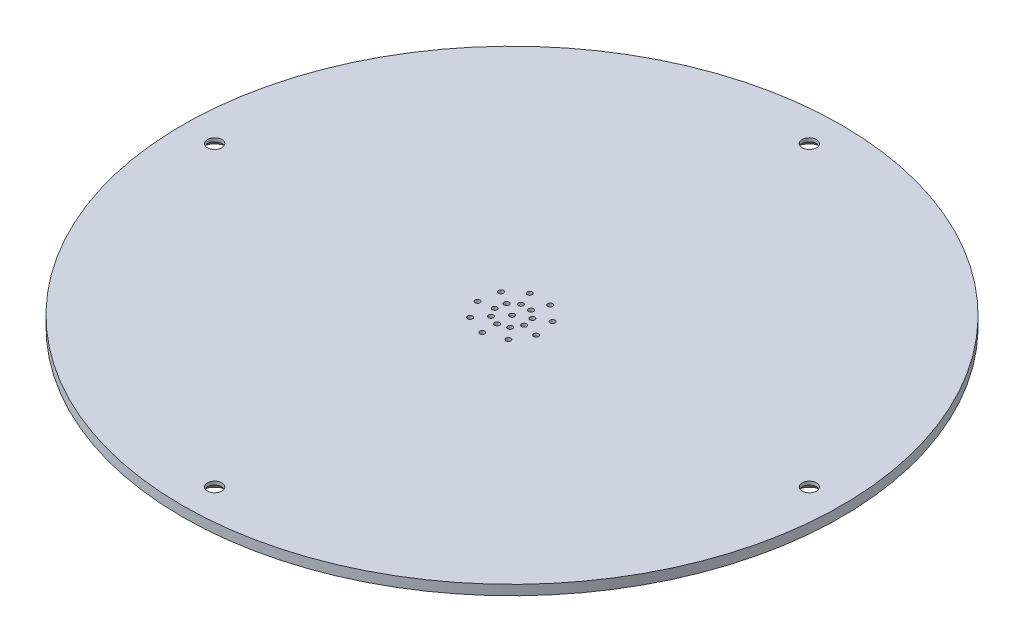
ISO-10303-21;
HEADER;
FILE_DESCRIPTION(('STEP AP214'),'2;1');
FILE_NAME('part.step','',(''),(''),'','','');
FILE_SCHEMA(('AUTOMOTIVE_DESIGN { 1 0 10303 214 1 1 1 1 }'));
ENDSEC;
DATA;
#1=APPLICATION_CONTEXT('core data for automotive mechanical design processes');
#2=APPLICATION_PROTOCOL_DEFINITION('international standard','automotive_design',2000,#1);
#3=PRODUCT_CONTEXT('',#1,'mechanical');
#4=PRODUCT('Part','Part','',(#3));
#5=PRODUCT_RELATED_PRODUCT_CATEGORY('part','',(#4));
#6=PRODUCT_DEFINITION_FORMATION('','',#4);
#7=PRODUCT_DEFINITION_CONTEXT('part definition',#1,'design');
#8=PRODUCT_DEFINITION('design','',#6,#7);
#9=PRODUCT_DEFINITION_SHAPE('','',#8);
#10=(LENGTH_UNIT() NAMED_UNIT(*) SI_UNIT(.MILLI.,.METRE.));
#11=(NAMED_UNIT(*) PLANE_ANGLE_UNIT() SI_UNIT($,.RADIAN.));
#12=(NAMED_UNIT(*) SI_UNIT($,.STERADIAN.) SOLID_ANGLE_UNIT());
#13=UNCERTAINTY_MEASURE_WITH_UNIT(LENGTH_MEASURE(1.E-05),#10,'distance_accuracy_value','');
#14=(GEOMETRIC_REPRESENTATION_CONTEXT(3) GLOBAL_UNCERTAINTY_ASSIGNED_CONTEXT((#13)) GLOBAL_UNIT_ASSIGNED_CONTEXT((#10,
#11,#12)) REPRESENTATION_CONTEXT('',''));
#15=CARTESIAN_POINT('',(0.,0.,0.));
#16=DIRECTION('',(0.,0.,1.));
#17=DIRECTION('',(1.,0.,0.));
#18=AXIS2_PLACEMENT_3D('',#15,#16,#17);
#19=CARTESIAN_POINT('',(0.,0.,0.));
#20=DIRECTION('',(0.,1.,0.));
#21=DIRECTION('',(0.,0.,1.));
#22=AXIS2_PLACEMENT_3D('',#19,#20,#21);
#23=PLANE('',#22);
#24=CARTESIAN_POINT('',(-2.05212085995398,0.,-5.63815572471546));
#25=DIRECTION('',(0.,-1.,0.));
#26=DIRECTION('',(0.342020143325663,0.,0.939692620785911));
#27=AXIS2_PLACEMENT_3D('',#24,#25,#26);
#28=CIRCLE('',#27,0.5);
#29=CARTESIAN_POINT('',(-1.88111078829115,0.,-5.16830941432251));
#30=VERTEX_POINT('',#29);
#31=EDGE_CURVE('E174',#30,#30,#28,.T.);
#32=ORIENTED_EDGE('',*,*,#31,.F.);
#33=EDGE_LOOP('',(#32));
#34=FACE_BOUND('',#33,.T.);
#35=CARTESIAN_POINT('',(-1.02606042997699,0.,-2.81907786235773));
#36=DIRECTION('',(0.,-1.,0.));
#37=DIRECTION('',(0.342020143325663,0.,0.939692620785911));
#38=AXIS2_PLACEMENT_3D('',#35,#36,#37);
#39=CIRCLE('',#38,0.5);
#40=CARTESIAN_POINT('',(-0.855050358314158,0.,-2.34923155196478));
#41=VERTEX_POINT('',#40);
#42=EDGE_CURVE('E168',#41,#41,#39,.T.);
#43=ORIENTED_EDGE('',*,*,#42,.F.);
#44=EDGE_LOOP('',(#43));
#45=FACE_BOUND('',#44,.T.);
#46=CARTESIAN_POINT('',(1.02606042997703,0.,-2.81907786235772));
#47=DIRECTION('',(0.,-1.,0.));
#48=DIRECTION('',(-0.342020143325676,0.,0.939692620785906));
#49=AXIS2_PLACEMENT_3D('',#46,#47,#48);
#50=CIRCLE('',#49,0.5);
#51=CARTESIAN_POINT('',(0.85505035831419,0.,-2.34923155196476));
#52=VERTEX_POINT('',#51);
#53=EDGE_CURVE('E193',#52,#52,#50,.T.);
#54=ORIENTED_EDGE('',*,*,#53,.F.);
#55=EDGE_LOOP('',(#54));
#56=FACE_BOUND('',#55,.T.);
#57=CARTESIAN_POINT('',(2.05212085995405,0.,-5.63815572471543));
#58=DIRECTION('',(0.,-1.,0.));
#59=DIRECTION('',(-0.342020143325676,0.,0.939692620785906));
#60=AXIS2_PLACEMENT_3D('',#57,#58,#59);
#61=CIRCLE('',#60,0.5);
#62=CARTESIAN_POINT('',(1.88111078829122,0.,-5.16830941432248));
#63=VERTEX_POINT('',#62);
#64=EDGE_CURVE('E187',#63,#63,#61,.T.);
#65=ORIENTED_EDGE('',*,*,#64,.F.);
#66=EDGE_LOOP('',(#65));
#67=FACE_BOUND('',#66,.T.);
#68=CARTESIAN_POINT('',(2.59807621135333,0.,-1.49999999999998));
#69=DIRECTION('',(0.,-1.,0.));
#70=DIRECTION('',(-0.866025403784443,0.,0.499999999999992));
#71=AXIS2_PLACEMENT_3D('',#68,#69,#70);
#72=CIRCLE('',#71,0.5);
#73=CARTESIAN_POINT('',(2.16506350946111,0.,-1.24999999999998));
#74=VERTEX_POINT('',#73);
#75=EDGE_CURVE('E180',#74,#74,#72,.T.);
#76=ORIENTED_EDGE('',*,*,#75,.F.);
#77=EDGE_LOOP('',(#76));
#78=FACE_BOUND('',#77,.T.);
#79=CARTESIAN_POINT('',(-1.92836282905962,0.,2.29813332935693));
#80=DIRECTION('',(0.,-1.,0.));
#81=DIRECTION('',(0.642787609686541,0.,-0.766044443118977));
#82=AXIS2_PLACEMENT_3D('',#79,#80,#81);
#83=CIRCLE('',#82,0.5);
#84=CARTESIAN_POINT('',(-1.60696902421635,0.,1.91511110779744));
#85=VERTEX_POINT('',#84);
#86=EDGE_CURVE('E145',#85,#85,#83,.T.);
#87=ORIENTED_EDGE('',*,*,#86,.F.);
#88=EDGE_LOOP('',(#87));
#89=FACE_BOUND('',#88,.T.);
#90=CARTESIAN_POINT('',(-3.85672565811924,0.,4.59626665871386));
#91=DIRECTION('',(0.,-1.,0.));
#92=DIRECTION('',(0.642787609686541,0.,-0.766044443118977));
#93=AXIS2_PLACEMENT_3D('',#90,#91,#92);
#94=CIRCLE('',#93,0.5);
#95=CARTESIAN_POINT('',(-3.53533185327597,0.,4.21324443715437));
#96=VERTEX_POINT('',#95);
#97=EDGE_CURVE('E139',#96,#96,#94,.T.);
#98=ORIENTED_EDGE('',*,*,#97,.F.);
#99=EDGE_LOOP('',(#98));
#100=FACE_BOUND('',#99,.T.);
#101=CARTESIAN_POINT('',(-2.95442325903663,0.,0.520944533000782));
#102=DIRECTION('',(0.,-1.,0.));
#103=DIRECTION('',(0.984807753012209,0.,-0.173648177666927));
#104=AXIS2_PLACEMENT_3D('',#101,#102,#103);
#105=CIRCLE('',#104,0.5);
#106=CARTESIAN_POINT('',(-2.46201938253052,0.,0.434120444167318));
#107=VERTEX_POINT('',#106);
#108=EDGE_CURVE('E132',#107,#107,#105,.T.);
#109=ORIENTED_EDGE('',*,*,#108,.F.);
#110=EDGE_LOOP('',(#109));
#111=FACE_BOUND('',#110,.T.);
#112=CARTESIAN_POINT('',(-5.90884651807325,0.,1.04188906600156));
#113=DIRECTION('',(0.,-1.,0.));
#114=DIRECTION('',(0.984807753012209,0.,-0.173648177666927));
#115=AXIS2_PLACEMENT_3D('',#112,#113,#114);
#116=CIRCLE('',#115,0.5);
#117=CARTESIAN_POINT('',(-5.41644264156715,0.,0.955064977168101));
#118=VERTEX_POINT('',#117);
#119=EDGE_CURVE('E163',#118,#118,#116,.T.);
#120=ORIENTED_EDGE('',*,*,#119,.F.);
#121=EDGE_LOOP('',(#120));
#122=FACE_BOUND('',#121,.T.);
#123=CARTESIAN_POINT('',(-2.59807621135331,0.,-1.50000000000001));
#124=DIRECTION('',(0.,-1.,0.));
#125=DIRECTION('',(0.866025403784436,0.,0.500000000000004));
#126=AXIS2_PLACEMENT_3D('',#123,#124,#125);
#127=CIRCLE('',#126,0.5);
#128=CARTESIAN_POINT('',(-2.16506350946109,0.,-1.25000000000001));
#129=VERTEX_POINT('',#128);
#130=EDGE_CURVE('E157',#129,#129,#127,.T.);
#131=ORIENTED_EDGE('',*,*,#130,.F.);
#132=EDGE_LOOP('',(#131));
#133=FACE_BOUND('',#132,.T.);
#134=CARTESIAN_POINT('',(-5.19615242270662,0.,-3.00000000000002));
#135=DIRECTION('',(0.,-1.,0.));
#136=DIRECTION('',(0.866025403784436,0.,0.500000000000004));
#137=AXIS2_PLACEMENT_3D('',#134,#135,#136);
#138=CIRCLE('',#137,0.5);
#139=CARTESIAN_POINT('',(-4.7631397208144,0.,-2.75000000000002));
#140=VERTEX_POINT('',#139);
#141=EDGE_CURVE('E150',#140,#140,#138,.T.);
#142=ORIENTED_EDGE('',*,*,#141,.F.);
#143=EDGE_LOOP('',(#142));
#144=FACE_BOUND('',#143,.T.);
#145=CARTESIAN_POINT('',(3.85672565811918,0.,4.59626665871392));
#146=DIRECTION('',(0.,-1.,0.));
#147=DIRECTION('',(-0.64278760968653,0.,-0.766044443118986));
#148=AXIS2_PLACEMENT_3D('',#145,#146,#147);
#149=CIRCLE('',#148,0.5);
#150=CARTESIAN_POINT('',(3.53533185327592,0.,4.21324443715442));
#151=VERTEX_POINT('',#150);
#152=EDGE_CURVE('E216',#151,#151,#149,.T.);
#153=ORIENTED_EDGE('',*,*,#152,.F.);
#154=EDGE_LOOP('',(#153));
#155=FACE_BOUND('',#154,.T.);
#156=CARTESIAN_POINT('',(1.92836282905959,0.,2.29813332935696));
#157=DIRECTION('',(0.,-1.,0.));
#158=DIRECTION('',(-0.64278760968653,0.,-0.766044443118986));
#159=AXIS2_PLACEMENT_3D('',#156,#157,#158);
#160=CIRCLE('',#159,0.5);
#161=CARTESIAN_POINT('',(1.60696902421633,0.,1.91511110779746));
#162=VERTEX_POINT('',#161);
#163=EDGE_CURVE('E222',#162,#162,#160,.T.);
#164=ORIENTED_EDGE('',*,*,#163,.F.);
#165=EDGE_LOOP('',(#164));
#166=FACE_BOUND('',#165,.T.);
#167=CARTESIAN_POINT('',(5.19615242270666,0.,-2.99999999999995));
#168=DIRECTION('',(0.,-1.,0.));
#169=DIRECTION('',(-0.866025403784443,0.,0.499999999999992));
#170=AXIS2_PLACEMENT_3D('',#167,#168,#169);
#171=CIRCLE('',#170,0.5);
#172=CARTESIAN_POINT('',(4.76313972081444,0.,-2.74999999999996));
#173=VERTEX_POINT('',#172);
#174=EDGE_CURVE('E198',#173,#173,#171,.T.);
#175=ORIENTED_EDGE('',*,*,#174,.F.);
#176=EDGE_LOOP('',(#175));
#177=FACE_BOUND('',#176,.T.);
#178=CARTESIAN_POINT('',(2.95442325903662,0.,0.520944533000821));
#179=DIRECTION('',(0.,-1.,0.));
#180=DIRECTION('',(-0.984807753012206,0.,-0.17364817766694));
#181=AXIS2_PLACEMENT_3D('',#178,#179,#180);
#182=CIRCLE('',#181,0.5);
#183=CARTESIAN_POINT('',(2.46201938253052,0.,0.434120444167351));
#184=VERTEX_POINT('',#183);
#185=EDGE_CURVE('E211',#184,#184,#182,.T.);
#186=ORIENTED_EDGE('',*,*,#185,.F.);
#187=EDGE_LOOP('',(#186));
#188=FACE_BOUND('',#187,.T.);
#189=CARTESIAN_POINT('',(5.90884651807324,0.,1.04188906600164));
#190=DIRECTION('',(0.,-1.,0.));
#191=DIRECTION('',(-0.984807753012206,0.,-0.17364817766694));
#192=AXIS2_PLACEMENT_3D('',#189,#190,#191);
#193=CIRCLE('',#192,0.5);
#194=CARTESIAN_POINT('',(5.41644264156713,0.,0.955064977168173));
#195=VERTEX_POINT('',#194);
#196=EDGE_CURVE('E204',#195,#195,#193,.T.);
#197=ORIENTED_EDGE('',*,*,#196,.F.);
#198=EDGE_LOOP('',(#197));
#199=FACE_BOUND('',#198,.T.);
#200=CARTESIAN_POINT('',(0.,0.,0.));
#201=DIRECTION('',(0.,-1.,0.));
#202=DIRECTION('',(0.,0.,-1.));
#203=AXIS2_PLACEMENT_3D('',#200,#201,#202);
#204=CIRCLE('',#203,0.5);
#205=CARTESIAN_POINT('',(0.,0.,-0.5));
#206=VERTEX_POINT('',#205);
#207=EDGE_CURVE('E127',#206,#206,#204,.T.);
#208=ORIENTED_EDGE('',*,*,#207,.F.);
#209=EDGE_LOOP('',(#208));
#210=FACE_BOUND('',#209,.T.);
#211=CARTESIAN_POINT('',(0.,0.,3.));
#212=DIRECTION('',(0.,-1.,0.));
#213=DIRECTION('',(0.,0.,-1.));
#214=AXIS2_PLACEMENT_3D('',#211,#212,#213);
#215=CIRCLE('',#214,0.5);
#216=CARTESIAN_POINT('',(0.,0.,2.5));
#217=VERTEX_POINT('',#216);
#218=EDGE_CURVE('E124',#217,#217,#215,.T.);
#219=ORIENTED_EDGE('',*,*,#218,.F.);
#220=EDGE_LOOP('',(#219));
#221=FACE_BOUND('',#220,.T.);
#222=CARTESIAN_POINT('',(0.,0.,6.));
#223=DIRECTION('',(0.,-1.,0.));
#224=DIRECTION('',(0.,0.,-1.));
#225=AXIS2_PLACEMENT_3D('',#222,#223,#224);
#226=CIRCLE('',#225,0.5);
#227=CARTESIAN_POINT('',(0.,0.,5.5));
#228=VERTEX_POINT('',#227);
#229=EDGE_CURVE('E117',#228,#228,#226,.T.);
#230=ORIENTED_EDGE('',*,*,#229,.F.);
#231=EDGE_LOOP('',(#230));
#232=FACE_BOUND('',#231,.T.);
#233=CARTESIAN_POINT('',(38.89087296526,0.,39.0017173845877));
#234=DIRECTION('',(0.,-1.,0.));
#235=DIRECTION('',(1.,0.,0.));
#236=AXIS2_PLACEMENT_3D('',#233,#234,#235);
#237=CIRCLE('',#236,2.5);
#238=CARTESIAN_POINT('',(41.39087296526,0.,39.0017173845877));
#239=VERTEX_POINT('',#238);
#240=EDGE_CURVE('E109',#239,#239,#237,.T.);
#241=ORIENTED_EDGE('',*,*,#240,.F.);
#242=EDGE_LOOP('',(#241));
#243=FACE_BOUND('',#242,.T.);
#244=CARTESIAN_POINT('',(-39.0017173845876,0.,39.0017173845877));
#245=DIRECTION('',(0.,-1.,0.));
#246=DIRECTION('',(0.,0.,1.));
#247=AXIS2_PLACEMENT_3D('',#244,#245,#246);
#248=CIRCLE('',#247,2.5);
#249=CARTESIAN_POINT('',(-39.0017173845876,0.,41.5017173845877));
#250=VERTEX_POINT('',#249);
#251=EDGE_CURVE('E103',#250,#250,#248,.T.);
#252=ORIENTED_EDGE('',*,*,#251,.F.);
#253=EDGE_LOOP('',(#252));
#254=FACE_BOUND('',#253,.T.);
#255=CARTESIAN_POINT('',(-39.0017173845873,0.,-38.8908729652605));
#256=DIRECTION('',(0.,-1.,0.));
#257=DIRECTION('',(-1.,0.,0.));
#258=AXIS2_PLACEMENT_3D('',#255,#256,#257);
#259=CIRCLE('',#258,2.5);
#260=CARTESIAN_POINT('',(-41.5017173845873,0.,-38.8908729652605));
#261=VERTEX_POINT('',#260);
#262=EDGE_CURVE('E96',#261,#261,#259,.T.);
#263=ORIENTED_EDGE('',*,*,#262,.F.);
#264=EDGE_LOOP('',(#263));
#265=FACE_BOUND('',#264,.T.);
#266=CARTESIAN_POINT('',(38.8908729652601,0.,-38.8908729652602));
#267=DIRECTION('',(0.,-1.,0.));
#268=DIRECTION('',(0.,0.,-1.));
#269=AXIS2_PLACEMENT_3D('',#266,#267,#268);
#270=CIRCLE('',#269,2.5);
#271=CARTESIAN_POINT('',(38.8908729652601,0.,-41.3908729652602));
#272=VERTEX_POINT('',#271);
#273=EDGE_CURVE('E90',#272,#272,#270,.T.);
#274=ORIENTED_EDGE('',*,*,#273,.F.);
#275=EDGE_LOOP('',(#274));
#276=FACE_BOUND('',#275,.T.);
#277=CARTESIAN_POINT('',(60.,0.,-4.18977760661176E-13));
#278=DIRECTION('',(0.,-1.,0.));
#279=DIRECTION('',(0.,0.,-1.));
#280=AXIS2_PLACEMENT_3D('',#277,#278,#279);
#281=CIRCLE('',#280,2.75);
#282=CARTESIAN_POINT('',(60.,0.,-2.75000000000042));
#283=VERTEX_POINT('',#282);
#284=EDGE_CURVE('E86',#283,#283,#281,.T.);
#285=ORIENTED_EDGE('',*,*,#284,.F.);
#286=EDGE_LOOP('',(#285));
#287=FACE_BOUND('',#286,.T.);
#288=CARTESIAN_POINT('',(-6.28466640991764E-13,0.,-60.));
#289=DIRECTION('',(0.,-1.,0.));
#290=DIRECTION('',(0.,0.,-1.));
#291=AXIS2_PLACEMENT_3D('',#288,#289,#290);
#292=CIRCLE('',#291,2.75);
#293=CARTESIAN_POINT('',(-6.28466640991764E-13,0.,-62.75));
#294=VERTEX_POINT('',#293);
#295=EDGE_CURVE('E77',#294,#294,#292,.T.);
#296=ORIENTED_EDGE('',*,*,#295,.F.);
#297=EDGE_LOOP('',(#296));
#298=FACE_BOUND('',#297,.T.);
#299=CARTESIAN_POINT('',(-60.,0.,0.));
#300=DIRECTION('',(0.,-1.,0.));
#301=DIRECTION('',(0.,0.,-1.));
#302=AXIS2_PLACEMENT_3D('',#299,#300,#301);
#303=CIRCLE('',#302,2.75);
#304=CARTESIAN_POINT('',(-60.,0.,-2.75));
#305=VERTEX_POINT('',#304);
#306=EDGE_CURVE('E68',#305,#305,#303,.T.);
#307=ORIENTED_EDGE('',*,*,#306,.F.);
#308=EDGE_LOOP('',(#307));
#309=FACE_BOUND('',#308,.T.);
#310=CARTESIAN_POINT('',(0.,0.,0.));
#311=DIRECTION('',(0.,1.,0.));
#312=DIRECTION('',(0.,0.,1.));
#313=AXIS2_PLACEMENT_3D('',#310,#311,#312);
#314=CIRCLE('',#313,66.5);
#315=CARTESIAN_POINT('',(0.,0.,66.5));
#316=VERTEX_POINT('',#315);
#317=EDGE_CURVE('E45',#316,#316,#314,.T.);
#318=ORIENTED_EDGE('',*,*,#317,.F.);
#319=EDGE_LOOP('',(#318));
#320=FACE_BOUND('',#319,.T.);
#321=CARTESIAN_POINT('',(2.09488880330588E-13,0.,60.));
#322=DIRECTION('',(0.,-1.,0.));
#323=DIRECTION('',(0.,0.,-1.));
#324=AXIS2_PLACEMENT_3D('',#321,#322,#323);
#325=CIRCLE('',#324,2.75);
#326=CARTESIAN_POINT('',(2.09488880330588E-13,0.,57.25));
#327=VERTEX_POINT('',#326);
#328=EDGE_CURVE('E59',#327,#327,#325,.T.);
#329=ORIENTED_EDGE('',*,*,#328,.F.);
#330=EDGE_LOOP('',(#329));
#331=FACE_BOUND('',#330,.T.);
#332=ADVANCED_FACE('F41',(#34,#45,#56,#67,#78,#89,#100,#111,#122,#133,#144,#155,#166,#177,#188,
#199,#210,#221,#232,#243,#254,#265,#276,#287,#298,#309,#320,#331),#23,.F.);
#333=CARTESIAN_POINT('',(0.,2.,0.));
#334=DIRECTION('',(0.,-1.,0.));
#335=DIRECTION('',(0.,0.,-1.));
#336=AXIS2_PLACEMENT_3D('',#333,#334,#335);
#337=CYLINDRICAL_SURFACE('',#336,66.5);
#338=CARTESIAN_POINT('',(0.,2.,0.));
#339=DIRECTION('',(0.,1.,0.));
#340=DIRECTION('',(0.,0.,1.));
#341=AXIS2_PLACEMENT_3D('',#338,#339,#340);
#342=CIRCLE('',#341,66.5);
#343=CARTESIAN_POINT('',(0.,2.,66.5));
#344=VERTEX_POINT('',#343);
#345=EDGE_CURVE('E10',#344,#344,#342,.T.);
#346=ORIENTED_EDGE('',*,*,#345,.F.);
#347=EDGE_LOOP('',(#346));
#348=FACE_BOUND('',#347,.T.);
#349=ORIENTED_EDGE('',*,*,#317,.T.);
#350=EDGE_LOOP('',(#349));
#351=FACE_BOUND('',#350,.T.);
#352=ADVANCED_FACE('F43',(#348,#351),#337,.T.);
#353=CARTESIAN_POINT('',(0.,2.,0.));
#354=DIRECTION('',(0.,1.,0.));
#355=DIRECTION('',(0.,0.,1.));
#356=AXIS2_PLACEMENT_3D('',#353,#354,#355);
#357=PLANE('',#356);
#358=CARTESIAN_POINT('',(-2.05212085995398,2.,-5.63815572471546));
#359=DIRECTION('',(0.,-1.,0.));
#360=DIRECTION('',(0.342020143325663,0.,0.939692620785911));
#361=AXIS2_PLACEMENT_3D('',#358,#359,#360);
#362=CIRCLE('',#361,0.5);
#363=CARTESIAN_POINT('',(-1.88111078829115,2.,-5.16830941432251));
#364=VERTEX_POINT('',#363);
#365=EDGE_CURVE('E171',#364,#364,#362,.T.);
#366=ORIENTED_EDGE('',*,*,#365,.T.);
#367=EDGE_LOOP('',(#366));
#368=FACE_BOUND('',#367,.T.);
#369=CARTESIAN_POINT('',(-1.02606042997699,2.,-2.81907786235773));
#370=DIRECTION('',(0.,-1.,0.));
#371=DIRECTION('',(0.342020143325663,0.,0.939692620785911));
#372=AXIS2_PLACEMENT_3D('',#369,#370,#371);
#373=CIRCLE('',#372,0.5);
#374=CARTESIAN_POINT('',(-0.855050358314158,2.,-2.34923155196478));
#375=VERTEX_POINT('',#374);
#376=EDGE_CURVE('E154',#375,#375,#373,.T.);
#377=ORIENTED_EDGE('',*,*,#376,.T.);
#378=EDGE_LOOP('',(#377));
#379=FACE_BOUND('',#378,.T.);
#380=CARTESIAN_POINT('',(1.02606042997703,2.,-2.81907786235772));
#381=DIRECTION('',(0.,-1.,0.));
#382=DIRECTION('',(-0.342020143325676,0.,0.939692620785906));
#383=AXIS2_PLACEMENT_3D('',#380,#381,#382);
#384=CIRCLE('',#383,0.5);
#385=CARTESIAN_POINT('',(0.85505035831419,2.,-2.34923155196476));
#386=VERTEX_POINT('',#385);
#387=EDGE_CURVE('E177',#386,#386,#384,.T.);
#388=ORIENTED_EDGE('',*,*,#387,.T.);
#389=EDGE_LOOP('',(#388));
#390=FACE_BOUND('',#389,.T.);
#391=CARTESIAN_POINT('',(2.05212085995405,2.,-5.63815572471543));
#392=DIRECTION('',(0.,-1.,0.));
#393=DIRECTION('',(-0.342020143325676,0.,0.939692620785906));
#394=AXIS2_PLACEMENT_3D('',#391,#392,#393);
#395=CIRCLE('',#394,0.5);
#396=CARTESIAN_POINT('',(1.88111078829122,2.,-5.16830941432248));
#397=VERTEX_POINT('',#396);
#398=EDGE_CURVE('E190',#397,#397,#395,.T.);
#399=ORIENTED_EDGE('',*,*,#398,.T.);
#400=EDGE_LOOP('',(#399));
#401=FACE_BOUND('',#400,.T.);
#402=CARTESIAN_POINT('',(2.59807621135333,2.,-1.49999999999998));
#403=DIRECTION('',(0.,-1.,0.));
#404=DIRECTION('',(-0.866025403784443,0.,0.499999999999992));
#405=AXIS2_PLACEMENT_3D('',#402,#403,#404);
#406=CIRCLE('',#405,0.5);
#407=CARTESIAN_POINT('',(2.16506350946111,2.,-1.24999999999998));
#408=VERTEX_POINT('',#407);
#409=EDGE_CURVE('E183',#408,#408,#406,.T.);
#410=ORIENTED_EDGE('',*,*,#409,.T.);
#411=EDGE_LOOP('',(#410));
#412=FACE_BOUND('',#411,.T.);
#413=CARTESIAN_POINT('',(-1.92836282905962,2.,2.29813332935693));
#414=DIRECTION('',(0.,-1.,0.));
#415=DIRECTION('',(0.642787609686541,0.,-0.766044443118977));
#416=AXIS2_PLACEMENT_3D('',#413,#414,#415);
#417=CIRCLE('',#416,0.5);
#418=CARTESIAN_POINT('',(-1.60696902421635,2.,1.91511110779744));
#419=VERTEX_POINT('',#418);
#420=EDGE_CURVE('E118',#419,#419,#417,.T.);
#421=ORIENTED_EDGE('',*,*,#420,.T.);
#422=EDGE_LOOP('',(#421));
#423=FACE_BOUND('',#422,.T.);
#424=CARTESIAN_POINT('',(-3.85672565811924,2.,4.59626665871386));
#425=DIRECTION('',(0.,-1.,0.));
#426=DIRECTION('',(0.642787609686541,0.,-0.766044443118977));
#427=AXIS2_PLACEMENT_3D('',#424,#425,#426);
#428=CIRCLE('',#427,0.5);
#429=CARTESIAN_POINT('',(-3.53533185327597,2.,4.21324443715437));
#430=VERTEX_POINT('',#429);
#431=EDGE_CURVE('E142',#430,#430,#428,.T.);
#432=ORIENTED_EDGE('',*,*,#431,.T.);
#433=EDGE_LOOP('',(#432));
#434=FACE_BOUND('',#433,.T.);
#435=CARTESIAN_POINT('',(-2.95442325903663,2.,0.520944533000782));
#436=DIRECTION('',(0.,-1.,0.));
#437=DIRECTION('',(0.984807753012209,0.,-0.173648177666927));
#438=AXIS2_PLACEMENT_3D('',#435,#436,#437);
#439=CIRCLE('',#438,0.5);
#440=CARTESIAN_POINT('',(-2.46201938253052,2.,0.434120444167318));
#441=VERTEX_POINT('',#440);
#442=EDGE_CURVE('E135',#441,#441,#439,.T.);
#443=ORIENTED_EDGE('',*,*,#442,.T.);
#444=EDGE_LOOP('',(#443));
#445=FACE_BOUND('',#444,.T.);
#446=CARTESIAN_POINT('',(-5.90884651807325,2.,1.04188906600156));
#447=DIRECTION('',(0.,-1.,0.));
#448=DIRECTION('',(0.984807753012209,0.,-0.173648177666927));
#449=AXIS2_PLACEMENT_3D('',#446,#447,#448);
#450=CIRCLE('',#449,0.5);
#451=CARTESIAN_POINT('',(-5.41644264156715,2.,0.955064977168101));
#452=VERTEX_POINT('',#451);
#453=EDGE_CURVE('E136',#452,#452,#450,.T.);
#454=ORIENTED_EDGE('',*,*,#453,.T.);
#455=EDGE_LOOP('',(#454));
#456=FACE_BOUND('',#455,.T.);
#457=CARTESIAN_POINT('',(-2.59807621135331,2.,-1.50000000000001));
#458=DIRECTION('',(0.,-1.,0.));
#459=DIRECTION('',(0.866025403784436,0.,0.500000000000004));
#460=AXIS2_PLACEMENT_3D('',#457,#458,#459);
#461=CIRCLE('',#460,0.5);
#462=CARTESIAN_POINT('',(-2.16506350946109,2.,-1.25000000000001));
#463=VERTEX_POINT('',#462);
#464=EDGE_CURVE('E160',#463,#463,#461,.T.);
#465=ORIENTED_EDGE('',*,*,#464,.T.);
#466=EDGE_LOOP('',(#465));
#467=FACE_BOUND('',#466,.T.);
#468=CARTESIAN_POINT('',(-5.19615242270662,2.,-3.00000000000002));
#469=DIRECTION('',(0.,-1.,0.));
#470=DIRECTION('',(0.866025403784436,0.,0.500000000000004));
#471=AXIS2_PLACEMENT_3D('',#468,#469,#470);
#472=CIRCLE('',#471,0.5);
#473=CARTESIAN_POINT('',(-4.7631397208144,2.,-2.75000000000002));
#474=VERTEX_POINT('',#473);
#475=EDGE_CURVE('E153',#474,#474,#472,.T.);
#476=ORIENTED_EDGE('',*,*,#475,.T.);
#477=EDGE_LOOP('',(#476));
#478=FACE_BOUND('',#477,.T.);
#479=CARTESIAN_POINT('',(3.85672565811918,2.,4.59626665871392));
#480=DIRECTION('',(0.,-1.,0.));
#481=DIRECTION('',(-0.64278760968653,0.,-0.766044443118986));
#482=AXIS2_PLACEMENT_3D('',#479,#480,#481);
#483=CIRCLE('',#482,0.5);
#484=CARTESIAN_POINT('',(3.53533185327592,2.,4.21324443715442));
#485=VERTEX_POINT('',#484);
#486=EDGE_CURVE('E219',#485,#485,#483,.T.);
#487=ORIENTED_EDGE('',*,*,#486,.T.);
#488=EDGE_LOOP('',(#487));
#489=FACE_BOUND('',#488,.T.);
#490=CARTESIAN_POINT('',(1.92836282905959,2.,2.29813332935696));
#491=DIRECTION('',(0.,-1.,0.));
#492=DIRECTION('',(-0.64278760968653,0.,-0.766044443118986));
#493=AXIS2_PLACEMENT_3D('',#490,#491,#492);
#494=CIRCLE('',#493,0.5);
#495=CARTESIAN_POINT('',(1.60696902421633,2.,1.91511110779746));
#496=VERTEX_POINT('',#495);
#497=EDGE_CURVE('E208',#496,#496,#494,.T.);
#498=ORIENTED_EDGE('',*,*,#497,.T.);
#499=EDGE_LOOP('',(#498));
#500=FACE_BOUND('',#499,.T.);
#501=CARTESIAN_POINT('',(5.19615242270666,2.,-2.99999999999995));
#502=DIRECTION('',(0.,-1.,0.));
#503=DIRECTION('',(-0.866025403784443,0.,0.499999999999992));
#504=AXIS2_PLACEMENT_3D('',#501,#502,#503);
#505=CIRCLE('',#504,0.5);
#506=CARTESIAN_POINT('',(4.76313972081444,2.,-2.74999999999996));
#507=VERTEX_POINT('',#506);
#508=EDGE_CURVE('E184',#507,#507,#505,.T.);
#509=ORIENTED_EDGE('',*,*,#508,.T.);
#510=EDGE_LOOP('',(#509));
#511=FACE_BOUND('',#510,.T.);
#512=CARTESIAN_POINT('',(2.95442325903662,2.,0.520944533000821));
#513=DIRECTION('',(0.,-1.,0.));
#514=DIRECTION('',(-0.984807753012206,0.,-0.17364817766694));
#515=AXIS2_PLACEMENT_3D('',#512,#513,#514);
#516=CIRCLE('',#515,0.5);
#517=CARTESIAN_POINT('',(2.46201938253052,2.,0.434120444167351));
#518=VERTEX_POINT('',#517);
#519=EDGE_CURVE('E201',#518,#518,#516,.T.);
#520=ORIENTED_EDGE('',*,*,#519,.T.);
#521=EDGE_LOOP('',(#520));
#522=FACE_BOUND('',#521,.T.);
#523=CARTESIAN_POINT('',(5.90884651807324,2.,1.04188906600164));
#524=DIRECTION('',(0.,-1.,0.));
#525=DIRECTION('',(-0.984807753012206,0.,-0.17364817766694));
#526=AXIS2_PLACEMENT_3D('',#523,#524,#525);
#527=CIRCLE('',#526,0.5);
#528=CARTESIAN_POINT('',(5.41644264156713,2.,0.955064977168173));
#529=VERTEX_POINT('',#528);
#530=EDGE_CURVE('E207',#529,#529,#527,.T.);
#531=ORIENTED_EDGE('',*,*,#530,.T.);
#532=EDGE_LOOP('',(#531));
#533=FACE_BOUND('',#532,.T.);
#534=CARTESIAN_POINT('',(0.,2.,0.));
#535=DIRECTION('',(0.,-1.,0.));
#536=DIRECTION('',(0.,0.,-1.));
#537=AXIS2_PLACEMENT_3D('',#534,#535,#536);
#538=CIRCLE('',#537,0.5);
#539=CARTESIAN_POINT('',(0.,2.,-0.5));
#540=VERTEX_POINT('',#539);
#541=EDGE_CURVE('E100',#540,#540,#538,.T.);
#542=ORIENTED_EDGE('',*,*,#541,.T.);
#543=EDGE_LOOP('',(#542));
#544=FACE_BOUND('',#543,.T.);
#545=CARTESIAN_POINT('',(0.,2.,3.));
#546=DIRECTION('',(0.,-1.,0.));
#547=DIRECTION('',(0.,0.,-1.));
#548=AXIS2_PLACEMENT_3D('',#545,#546,#547);
#549=CIRCLE('',#548,0.5);
#550=CARTESIAN_POINT('',(0.,2.,2.5));
#551=VERTEX_POINT('',#550);
#552=EDGE_CURVE('E121',#551,#551,#549,.T.);
#553=ORIENTED_EDGE('',*,*,#552,.T.);
#554=EDGE_LOOP('',(#553));
#555=FACE_BOUND('',#554,.T.);
#556=CARTESIAN_POINT('',(0.,2.,6.));
#557=DIRECTION('',(0.,-1.,0.));
#558=DIRECTION('',(0.,0.,-1.));
#559=AXIS2_PLACEMENT_3D('',#556,#557,#558);
#560=CIRCLE('',#559,0.5);
#561=CARTESIAN_POINT('',(0.,2.,5.5));
#562=VERTEX_POINT('',#561);
#563=EDGE_CURVE('E114',#562,#562,#560,.T.);
#564=ORIENTED_EDGE('',*,*,#563,.T.);
#565=EDGE_LOOP('',(#564));
#566=FACE_BOUND('',#565,.T.);
#567=CARTESIAN_POINT('',(60.,2.,-4.18977760661176E-13));
#568=DIRECTION('',(0.,-1.,0.));
#569=DIRECTION('',(0.,0.,-1.));
#570=AXIS2_PLACEMENT_3D('',#567,#568,#569);
#571=CIRCLE('',#570,1.44999999999999);
#572=CARTESIAN_POINT('',(60.,2.,-1.4500000000004));
#573=VERTEX_POINT('',#572);
#574=EDGE_CURVE('E80',#573,#573,#571,.T.);
#575=ORIENTED_EDGE('',*,*,#574,.T.);
#576=EDGE_LOOP('',(#575));
#577=FACE_BOUND('',#576,.T.);
#578=CARTESIAN_POINT('',(-6.28466640991764E-13,2.,-60.));
#579=DIRECTION('',(0.,-1.,0.));
#580=DIRECTION('',(0.,0.,-1.));
#581=AXIS2_PLACEMENT_3D('',#578,#579,#580);
#582=CIRCLE('',#581,1.44999999999999);
#583=CARTESIAN_POINT('',(-6.28466640991764E-13,2.,-61.45));
#584=VERTEX_POINT('',#583);
#585=EDGE_CURVE('E71',#584,#584,#582,.T.);
#586=ORIENTED_EDGE('',*,*,#585,.T.);
#587=EDGE_LOOP('',(#586));
#588=FACE_BOUND('',#587,.T.);
#589=CARTESIAN_POINT('',(-60.,2.,0.));
#590=DIRECTION('',(0.,-1.,0.));
#591=DIRECTION('',(0.,0.,-1.));
#592=AXIS2_PLACEMENT_3D('',#589,#590,#591);
#593=CIRCLE('',#592,1.44999999999999);
#594=CARTESIAN_POINT('',(-60.,2.,-1.44999999999999));
#595=VERTEX_POINT('',#594);
#596=EDGE_CURVE('E62',#595,#595,#593,.T.);
#597=ORIENTED_EDGE('',*,*,#596,.T.);
#598=EDGE_LOOP('',(#597));
#599=FACE_BOUND('',#598,.T.);
#600=CARTESIAN_POINT('',(2.09488880330588E-13,2.,60.));
#601=DIRECTION('',(0.,-1.,0.));
#602=DIRECTION('',(0.,0.,-1.));
#603=AXIS2_PLACEMENT_3D('',#600,#601,#602);
#604=CIRCLE('',#603,1.44999999999999);
#605=CARTESIAN_POINT('',(2.09488880330588E-13,2.,58.55));
#606=VERTEX_POINT('',#605);
#607=EDGE_CURVE('E52',#606,#606,#604,.T.);
#608=ORIENTED_EDGE('',*,*,#607,.T.);
#609=EDGE_LOOP('',(#608));
#610=FACE_BOUND('',#609,.T.);
#611=ORIENTED_EDGE('',*,*,#345,.T.);
#612=EDGE_LOOP('',(#611));
#613=FACE_BOUND('',#612,.T.);
#614=ADVANCED_FACE('F228',(#368,#379,#390,#401,#412,#423,#434,#445,#456,#467,#478,#489,#500,
#511,#522,#533,#544,#555,#566,#577,#588,#599,#610,#613),#357,.T.);
#615=CARTESIAN_POINT('',(2.09488880330588E-13,0.,60.));
#616=DIRECTION('',(0.,-1.,0.));
#617=DIRECTION('',(0.,0.,-1.));
#618=AXIS2_PLACEMENT_3D('',#615,#616,#617);
#619=CYLINDRICAL_SURFACE('',#618,1.44999999999999);
#620=ORIENTED_EDGE('',*,*,#607,.F.);
#621=EDGE_LOOP('',(#620));
#622=FACE_BOUND('',#621,.T.);
#623=CARTESIAN_POINT('',(2.09488880330588E-13,1.30000000000001,60.));
#624=DIRECTION('',(0.,-1.,0.));
#625=DIRECTION('',(0.,0.,-1.));
#626=AXIS2_PLACEMENT_3D('',#623,#624,#625);
#627=CIRCLE('',#626,1.44999999999999);
#628=CARTESIAN_POINT('',(2.09488880330588E-13,1.30000000000001,58.55));
#629=VERTEX_POINT('',#628);
#630=EDGE_CURVE('E56',#629,#629,#627,.T.);
#631=ORIENTED_EDGE('',*,*,#630,.T.);
#632=EDGE_LOOP('',(#631));
#633=FACE_BOUND('',#632,.T.);
#634=ADVANCED_FACE('F275',(#622,#633),#619,.F.);
#635=CARTESIAN_POINT('',(2.09488880330588E-13,0.,60.));
#636=DIRECTION('',(0.,-1.,0.));
#637=DIRECTION('',(0.,0.,-1.));
#638=AXIS2_PLACEMENT_3D('',#635,#636,#637);
#639=CONICAL_SURFACE('',#638,2.75,0.785398163397448);
#640=ORIENTED_EDGE('',*,*,#630,.F.);
#641=EDGE_LOOP('',(#640));
#642=FACE_BOUND('',#641,.T.);
#643=ORIENTED_EDGE('',*,*,#328,.T.);
#644=EDGE_LOOP('',(#643));
#645=FACE_BOUND('',#644,.T.);
#646=ADVANCED_FACE('F272',(#642,#645),#639,.F.);
#647=CARTESIAN_POINT('',(-60.,0.,0.));
#648=DIRECTION('',(0.,-1.,0.));
#649=DIRECTION('',(0.,0.,-1.));
#650=AXIS2_PLACEMENT_3D('',#647,#648,#649);
#651=CYLINDRICAL_SURFACE('',#650,1.44999999999999);
#652=ORIENTED_EDGE('',*,*,#596,.F.);
#653=EDGE_LOOP('',(#652));
#654=FACE_BOUND('',#653,.T.);
#655=CARTESIAN_POINT('',(-60.,1.30000000000001,0.));
#656=DIRECTION('',(0.,-1.,0.));
#657=DIRECTION('',(0.,0.,-1.));
#658=AXIS2_PLACEMENT_3D('',#655,#656,#657);
#659=CIRCLE('',#658,1.44999999999999);
#660=CARTESIAN_POINT('',(-60.,1.30000000000001,-1.44999999999999));
#661=VERTEX_POINT('',#660);
#662=EDGE_CURVE('E65',#661,#661,#659,.T.);
#663=ORIENTED_EDGE('',*,*,#662,.T.);
#664=EDGE_LOOP('',(#663));
#665=FACE_BOUND('',#664,.T.);
#666=ADVANCED_FACE('F274',(#654,#665),#651,.F.);
#667=CARTESIAN_POINT('',(-60.,0.,0.));
#668=DIRECTION('',(0.,-1.,0.));
#669=DIRECTION('',(0.,0.,-1.));
#670=AXIS2_PLACEMENT_3D('',#667,#668,#669);
#671=CONICAL_SURFACE('',#670,2.75,0.78539816339745);
#672=ORIENTED_EDGE('',*,*,#662,.F.);
#673=EDGE_LOOP('',(#672));
#674=FACE_BOUND('',#673,.T.);
#675=ORIENTED_EDGE('',*,*,#306,.T.);
#676=EDGE_LOOP('',(#675));
#677=FACE_BOUND('',#676,.T.);
#678=ADVANCED_FACE('F282',(#674,#677),#671,.F.);
#679=CARTESIAN_POINT('',(-6.28466640991764E-13,0.,-60.));
#680=DIRECTION('',(0.,-1.,0.));
#681=DIRECTION('',(0.,0.,-1.));
#682=AXIS2_PLACEMENT_3D('',#679,#680,#681);
#683=CYLINDRICAL_SURFACE('',#682,1.44999999999999);
#684=ORIENTED_EDGE('',*,*,#585,.F.);
#685=EDGE_LOOP('',(#684));
#686=FACE_BOUND('',#685,.T.);
#687=CARTESIAN_POINT('',(-6.28466640991764E-13,1.30000000000001,-60.));
#688=DIRECTION('',(0.,-1.,0.));
#689=DIRECTION('',(0.,0.,-1.));
#690=AXIS2_PLACEMENT_3D('',#687,#688,#689);
#691=CIRCLE('',#690,1.44999999999999);
#692=CARTESIAN_POINT('',(-6.28466640991764E-13,1.30000000000001,-61.45));
#693=VERTEX_POINT('',#692);
#694=EDGE_CURVE('E74',#693,#693,#691,.T.);
#695=ORIENTED_EDGE('',*,*,#694,.T.);
#696=EDGE_LOOP('',(#695));
#697=FACE_BOUND('',#696,.T.);
#698=ADVANCED_FACE('F438',(#686,#697),#683,.F.);
#699=CARTESIAN_POINT('',(-6.28466640991764E-13,0.,-60.));
#700=DIRECTION('',(0.,-1.,0.));
#701=DIRECTION('',(0.,0.,-1.));
#702=AXIS2_PLACEMENT_3D('',#699,#700,#701);
#703=CONICAL_SURFACE('',#702,2.75,0.785398163397448);
#704=ORIENTED_EDGE('',*,*,#694,.F.);
#705=EDGE_LOOP('',(#704));
#706=FACE_BOUND('',#705,.T.);
#707=ORIENTED_EDGE('',*,*,#295,.T.);
#708=EDGE_LOOP('',(#707));
#709=FACE_BOUND('',#708,.T.);
#710=ADVANCED_FACE('F434',(#706,#709),#703,.F.);
#711=CARTESIAN_POINT('',(60.,0.,-4.18977760661176E-13));
#712=DIRECTION('',(0.,-1.,0.));
#713=DIRECTION('',(0.,0.,-1.));
#714=AXIS2_PLACEMENT_3D('',#711,#712,#713);
#715=CYLINDRICAL_SURFACE('',#714,1.44999999999999);
#716=ORIENTED_EDGE('',*,*,#574,.F.);
#717=EDGE_LOOP('',(#716));
#718=FACE_BOUND('',#717,.T.);
#719=CARTESIAN_POINT('',(60.,1.30000000000001,-4.18977760661176E-13));
#720=DIRECTION('',(0.,-1.,0.));
#721=DIRECTION('',(0.,0.,-1.));
#722=AXIS2_PLACEMENT_3D('',#719,#720,#721);
#723=CIRCLE('',#722,1.44999999999999);
#724=CARTESIAN_POINT('',(60.,1.30000000000001,-1.4500000000004));
#725=VERTEX_POINT('',#724);
#726=EDGE_CURVE('E83',#725,#725,#723,.T.);
#727=ORIENTED_EDGE('',*,*,#726,.T.);
#728=EDGE_LOOP('',(#727));
#729=FACE_BOUND('',#728,.T.);
#730=ADVANCED_FACE('F430',(#718,#729),#715,.F.);
#731=CARTESIAN_POINT('',(60.,0.,-4.18977760661176E-13));
#732=DIRECTION('',(0.,-1.,0.));
#733=DIRECTION('',(0.,0.,-1.));
#734=AXIS2_PLACEMENT_3D('',#731,#732,#733);
#735=CONICAL_SURFACE('',#734,2.75,0.78539816339745);
#736=ORIENTED_EDGE('',*,*,#726,.F.);
#737=EDGE_LOOP('',(#736));
#738=FACE_BOUND('',#737,.T.);
#739=ORIENTED_EDGE('',*,*,#284,.T.);
#740=EDGE_LOOP('',(#739));
#741=FACE_BOUND('',#740,.T.);
#742=ADVANCED_FACE('F426',(#738,#741),#735,.F.);
#743=CARTESIAN_POINT('',(38.8908729652601,1.,-38.8908729652602));
#744=DIRECTION('',(0.,-1.,0.));
#745=DIRECTION('',(0.,0.,-1.));
#746=AXIS2_PLACEMENT_3D('',#743,#744,#745);
#747=CYLINDRICAL_SURFACE('',#746,2.5);
#748=CARTESIAN_POINT('',(38.8908729652601,1.,-38.8908729652602));
#749=DIRECTION('',(0.,-1.,0.));
#750=DIRECTION('',(0.,0.,-1.));
#751=AXIS2_PLACEMENT_3D('',#748,#749,#750);
#752=CIRCLE('',#751,2.5);
#753=CARTESIAN_POINT('',(38.8908729652601,1.,-41.3908729652602));
#754=VERTEX_POINT('',#753);
#755=EDGE_CURVE('E89',#754,#754,#752,.T.);
#756=ORIENTED_EDGE('',*,*,#755,.F.);
#757=EDGE_LOOP('',(#756));
#758=FACE_BOUND('',#757,.T.);
#759=ORIENTED_EDGE('',*,*,#273,.T.);
#760=EDGE_LOOP('',(#759));
#761=FACE_BOUND('',#760,.T.);
#762=ADVANCED_FACE('F422',(#758,#761),#747,.F.);
#763=CARTESIAN_POINT('',(38.8908729652601,1.,-38.8908729652602));
#764=DIRECTION('',(0.,-1.,0.));
#765=DIRECTION('',(0.,0.,-1.));
#766=AXIS2_PLACEMENT_3D('',#763,#764,#765);
#767=PLANE('',#766);
#768=ORIENTED_EDGE('',*,*,#755,.T.);
#769=EDGE_LOOP('',(#768));
#770=FACE_BOUND('',#769,.T.);
#771=ADVANCED_FACE('F418',(#770),#767,.T.);
#772=CARTESIAN_POINT('',(-39.0017173845873,1.,-38.8908729652605));
#773=DIRECTION('',(0.,-1.,0.));
#774=DIRECTION('',(0.,0.,-1.));
#775=AXIS2_PLACEMENT_3D('',#772,#773,#774);
#776=CYLINDRICAL_SURFACE('',#775,2.5);
#777=CARTESIAN_POINT('',(-39.0017173845873,1.,-38.8908729652605));
#778=DIRECTION('',(0.,-1.,0.));
#779=DIRECTION('',(-1.,0.,0.));
#780=AXIS2_PLACEMENT_3D('',#777,#778,#779);
#781=CIRCLE('',#780,2.5);
#782=CARTESIAN_POINT('',(-41.5017173845873,1.,-38.8908729652605));
#783=VERTEX_POINT('',#782);
#784=EDGE_CURVE('E99',#783,#783,#781,.T.);
#785=ORIENTED_EDGE('',*,*,#784,.F.);
#786=EDGE_LOOP('',(#785));
#787=FACE_BOUND('',#786,.T.);
#788=ORIENTED_EDGE('',*,*,#262,.T.);
#789=EDGE_LOOP('',(#788));
#790=FACE_BOUND('',#789,.T.);
#791=ADVANCED_FACE('F414',(#787,#790),#776,.F.);
#792=CARTESIAN_POINT('',(-39.0017173845873,1.,-38.8908729652605));
#793=DIRECTION('',(0.,-1.,0.));
#794=DIRECTION('',(-1.,0.,0.));
#795=AXIS2_PLACEMENT_3D('',#792,#793,#794);
#796=PLANE('',#795);
#797=ORIENTED_EDGE('',*,*,#784,.T.);
#798=EDGE_LOOP('',(#797));
#799=FACE_BOUND('',#798,.T.);
#800=ADVANCED_FACE('F410',(#799),#796,.T.);
#801=CARTESIAN_POINT('',(-39.0017173845876,1.,39.0017173845877));
#802=DIRECTION('',(0.,-1.,0.));
#803=DIRECTION('',(0.,0.,-1.));
#804=AXIS2_PLACEMENT_3D('',#801,#802,#803);
#805=CYLINDRICAL_SURFACE('',#804,2.5);
#806=CARTESIAN_POINT('',(-39.0017173845876,1.,39.0017173845877));
#807=DIRECTION('',(0.,-1.,0.));
#808=DIRECTION('',(0.,0.,1.));
#809=AXIS2_PLACEMENT_3D('',#806,#807,#808);
#810=CIRCLE('',#809,2.5);
#811=CARTESIAN_POINT('',(-39.0017173845876,1.,41.5017173845877));
#812=VERTEX_POINT('',#811);
#813=EDGE_CURVE('E106',#812,#812,#810,.T.);
#814=ORIENTED_EDGE('',*,*,#813,.F.);
#815=EDGE_LOOP('',(#814));
#816=FACE_BOUND('',#815,.T.);
#817=ORIENTED_EDGE('',*,*,#251,.T.);
#818=EDGE_LOOP('',(#817));
#819=FACE_BOUND('',#818,.T.);
#820=ADVANCED_FACE('F406',(#816,#819),#805,.F.);
#821=CARTESIAN_POINT('',(-39.0017173845876,1.,39.0017173845877));
#822=DIRECTION('',(0.,-1.,0.));
#823=DIRECTION('',(0.,0.,1.));
#824=AXIS2_PLACEMENT_3D('',#821,#822,#823);
#825=PLANE('',#824);
#826=ORIENTED_EDGE('',*,*,#813,.T.);
#827=EDGE_LOOP('',(#826));
#828=FACE_BOUND('',#827,.T.);
#829=ADVANCED_FACE('F402',(#828),#825,.T.);
#830=CARTESIAN_POINT('',(38.89087296526,1.,39.0017173845877));
#831=DIRECTION('',(0.,-1.,0.));
#832=DIRECTION('',(0.,0.,-1.));
#833=AXIS2_PLACEMENT_3D('',#830,#831,#832);
#834=CYLINDRICAL_SURFACE('',#833,2.5);
#835=CARTESIAN_POINT('',(38.89087296526,1.,39.0017173845877));
#836=DIRECTION('',(0.,-1.,0.));
#837=DIRECTION('',(1.,0.,0.));
#838=AXIS2_PLACEMENT_3D('',#835,#836,#837);
#839=CIRCLE('',#838,2.5);
#840=CARTESIAN_POINT('',(41.39087296526,1.,39.0017173845877));
#841=VERTEX_POINT('',#840);
#842=EDGE_CURVE('E93',#841,#841,#839,.T.);
#843=ORIENTED_EDGE('',*,*,#842,.F.);
#844=EDGE_LOOP('',(#843));
#845=FACE_BOUND('',#844,.T.);
#846=ORIENTED_EDGE('',*,*,#240,.T.);
#847=EDGE_LOOP('',(#846));
#848=FACE_BOUND('',#847,.T.);
#849=ADVANCED_FACE('F398',(#845,#848),#834,.F.);
#850=CARTESIAN_POINT('',(38.89087296526,1.,39.0017173845877));
#851=DIRECTION('',(0.,-1.,0.));
#852=DIRECTION('',(1.,0.,0.));
#853=AXIS2_PLACEMENT_3D('',#850,#851,#852);
#854=PLANE('',#853);
#855=ORIENTED_EDGE('',*,*,#842,.T.);
#856=EDGE_LOOP('',(#855));
#857=FACE_BOUND('',#856,.T.);
#858=ADVANCED_FACE('F394',(#857),#854,.T.);
#859=CARTESIAN_POINT('',(0.,2.,6.));
#860=DIRECTION('',(0.,-1.,0.));
#861=DIRECTION('',(0.,0.,-1.));
#862=AXIS2_PLACEMENT_3D('',#859,#860,#861);
#863=CYLINDRICAL_SURFACE('',#862,0.5);
#864=ORIENTED_EDGE('',*,*,#563,.F.);
#865=EDGE_LOOP('',(#864));
#866=FACE_BOUND('',#865,.T.);
#867=ORIENTED_EDGE('',*,*,#229,.T.);
#868=EDGE_LOOP('',(#867));
#869=FACE_BOUND('',#868,.T.);
#870=ADVANCED_FACE('F390',(#866,#869),#863,.F.);
#871=CARTESIAN_POINT('',(0.,2.,3.));
#872=DIRECTION('',(0.,-1.,0.));
#873=DIRECTION('',(0.,0.,-1.));
#874=AXIS2_PLACEMENT_3D('',#871,#872,#873);
#875=CYLINDRICAL_SURFACE('',#874,0.5);
#876=ORIENTED_EDGE('',*,*,#552,.F.);
#877=EDGE_LOOP('',(#876));
#878=FACE_BOUND('',#877,.T.);
#879=ORIENTED_EDGE('',*,*,#218,.T.);
#880=EDGE_LOOP('',(#879));
#881=FACE_BOUND('',#880,.T.);
#882=ADVANCED_FACE('F386',(#878,#881),#875,.F.);
#883=CARTESIAN_POINT('',(0.,2.,0.));
#884=DIRECTION('',(0.,-1.,0.));
#885=DIRECTION('',(0.,0.,-1.));
#886=AXIS2_PLACEMENT_3D('',#883,#884,#885);
#887=CYLINDRICAL_SURFACE('',#886,0.5);
#888=ORIENTED_EDGE('',*,*,#541,.F.);
#889=EDGE_LOOP('',(#888));
#890=FACE_BOUND('',#889,.T.);
#891=ORIENTED_EDGE('',*,*,#207,.T.);
#892=EDGE_LOOP('',(#891));
#893=FACE_BOUND('',#892,.T.);
#894=ADVANCED_FACE('F340',(#890,#893),#887,.F.);
#895=CARTESIAN_POINT('',(5.90884651807324,2.,1.04188906600164));
#896=DIRECTION('',(0.,-1.,0.));
#897=DIRECTION('',(0.,0.,-1.));
#898=AXIS2_PLACEMENT_3D('',#895,#896,#897);
#899=CYLINDRICAL_SURFACE('',#898,0.5);
#900=ORIENTED_EDGE('',*,*,#530,.F.);
#901=EDGE_LOOP('',(#900));
#902=FACE_BOUND('',#901,.T.);
#903=ORIENTED_EDGE('',*,*,#196,.T.);
#904=EDGE_LOOP('',(#903));
#905=FACE_BOUND('',#904,.T.);
#906=ADVANCED_FACE('F337',(#902,#905),#899,.F.);
#907=CARTESIAN_POINT('',(2.95442325903662,2.,0.520944533000821));
#908=DIRECTION('',(0.,-1.,0.));
#909=DIRECTION('',(0.,0.,-1.));
#910=AXIS2_PLACEMENT_3D('',#907,#908,#909);
#911=CYLINDRICAL_SURFACE('',#910,0.5);
#912=ORIENTED_EDGE('',*,*,#519,.F.);
#913=EDGE_LOOP('',(#912));
#914=FACE_BOUND('',#913,.T.);
#915=ORIENTED_EDGE('',*,*,#185,.T.);
#916=EDGE_LOOP('',(#915));
#917=FACE_BOUND('',#916,.T.);
#918=ADVANCED_FACE('F334',(#914,#917),#911,.F.);
#919=CARTESIAN_POINT('',(5.19615242270666,2.,-2.99999999999995));
#920=DIRECTION('',(0.,-1.,0.));
#921=DIRECTION('',(0.,0.,-1.));
#922=AXIS2_PLACEMENT_3D('',#919,#920,#921);
#923=CYLINDRICAL_SURFACE('',#922,0.5);
#924=ORIENTED_EDGE('',*,*,#508,.F.);
#925=EDGE_LOOP('',(#924));
#926=FACE_BOUND('',#925,.T.);
#927=ORIENTED_EDGE('',*,*,#174,.T.);
#928=EDGE_LOOP('',(#927));
#929=FACE_BOUND('',#928,.T.);
#930=ADVANCED_FACE('F235',(#926,#929),#923,.F.);
#931=CARTESIAN_POINT('',(1.92836282905959,2.,2.29813332935696));
#932=DIRECTION('',(0.,-1.,0.));
#933=DIRECTION('',(0.,0.,-1.));
#934=AXIS2_PLACEMENT_3D('',#931,#932,#933);
#935=CYLINDRICAL_SURFACE('',#934,0.5);
#936=ORIENTED_EDGE('',*,*,#497,.F.);
#937=EDGE_LOOP('',(#936));
#938=FACE_BOUND('',#937,.T.);
#939=ORIENTED_EDGE('',*,*,#163,.T.);
#940=EDGE_LOOP('',(#939));
#941=FACE_BOUND('',#940,.T.);
#942=ADVANCED_FACE('F231',(#938,#941),#935,.F.);
#943=CARTESIAN_POINT('',(3.85672565811918,2.,4.59626665871392));
#944=DIRECTION('',(0.,-1.,0.));
#945=DIRECTION('',(0.,0.,-1.));
#946=AXIS2_PLACEMENT_3D('',#943,#944,#945);
#947=CYLINDRICAL_SURFACE('',#946,0.5);
#948=ORIENTED_EDGE('',*,*,#486,.F.);
#949=EDGE_LOOP('',(#948));
#950=FACE_BOUND('',#949,.T.);
#951=ORIENTED_EDGE('',*,*,#152,.T.);
#952=EDGE_LOOP('',(#951));
#953=FACE_BOUND('',#952,.T.);
#954=ADVANCED_FACE('F234',(#950,#953),#947,.F.);
#955=CARTESIAN_POINT('',(-5.19615242270662,2.,-3.00000000000002));
#956=DIRECTION('',(0.,-1.,0.));
#957=DIRECTION('',(0.,0.,-1.));
#958=AXIS2_PLACEMENT_3D('',#955,#956,#957);
#959=CYLINDRICAL_SURFACE('',#958,0.5);
#960=ORIENTED_EDGE('',*,*,#475,.F.);
#961=EDGE_LOOP('',(#960));
#962=FACE_BOUND('',#961,.T.);
#963=ORIENTED_EDGE('',*,*,#141,.T.);
#964=EDGE_LOOP('',(#963));
#965=FACE_BOUND('',#964,.T.);
#966=ADVANCED_FACE('F323',(#962,#965),#959,.F.);
#967=CARTESIAN_POINT('',(-2.59807621135331,2.,-1.50000000000001));
#968=DIRECTION('',(0.,-1.,0.));
#969=DIRECTION('',(0.,0.,-1.));
#970=AXIS2_PLACEMENT_3D('',#967,#968,#969);
#971=CYLINDRICAL_SURFACE('',#970,0.5);
#972=ORIENTED_EDGE('',*,*,#464,.F.);
#973=EDGE_LOOP('',(#972));
#974=FACE_BOUND('',#973,.T.);
#975=ORIENTED_EDGE('',*,*,#130,.T.);
#976=EDGE_LOOP('',(#975));
#977=FACE_BOUND('',#976,.T.);
#978=ADVANCED_FACE('F330',(#974,#977),#971,.F.);
#979=CARTESIAN_POINT('',(-5.90884651807325,2.,1.04188906600156));
#980=DIRECTION('',(0.,-1.,0.));
#981=DIRECTION('',(0.,0.,-1.));
#982=AXIS2_PLACEMENT_3D('',#979,#980,#981);
#983=CYLINDRICAL_SURFACE('',#982,0.5);
#984=ORIENTED_EDGE('',*,*,#453,.F.);
#985=EDGE_LOOP('',(#984));
#986=FACE_BOUND('',#985,.T.);
#987=ORIENTED_EDGE('',*,*,#119,.T.);
#988=EDGE_LOOP('',(#987));
#989=FACE_BOUND('',#988,.T.);
#990=ADVANCED_FACE('F366',(#986,#989),#983,.F.);
#991=CARTESIAN_POINT('',(-2.95442325903663,2.,0.520944533000782));
#992=DIRECTION('',(0.,-1.,0.));
#993=DIRECTION('',(0.,0.,-1.));
#994=AXIS2_PLACEMENT_3D('',#991,#992,#993);
#995=CYLINDRICAL_SURFACE('',#994,0.5);
#996=ORIENTED_EDGE('',*,*,#442,.F.);
#997=EDGE_LOOP('',(#996));
#998=FACE_BOUND('',#997,.T.);
#999=ORIENTED_EDGE('',*,*,#108,.T.);
#1000=EDGE_LOOP('',(#999));
#1001=FACE_BOUND('',#1000,.T.);
#1002=ADVANCED_FACE('F369',(#998,#1001),#995,.F.);
#1003=CARTESIAN_POINT('',(-3.85672565811924,2.,4.59626665871386));
#1004=DIRECTION('',(0.,-1.,0.));
#1005=DIRECTION('',(0.,0.,-1.));
#1006=AXIS2_PLACEMENT_3D('',#1003,#1004,#1005);
#1007=CYLINDRICAL_SURFACE('',#1006,0.5);
#1008=ORIENTED_EDGE('',*,*,#431,.F.);
#1009=EDGE_LOOP('',(#1008));
#1010=FACE_BOUND('',#1009,.T.);
#1011=ORIENTED_EDGE('',*,*,#97,.T.);
#1012=EDGE_LOOP('',(#1011));
#1013=FACE_BOUND('',#1012,.T.);
#1014=ADVANCED_FACE('F376',(#1010,#1013),#1007,.F.);
#1015=CARTESIAN_POINT('',(-1.92836282905962,2.,2.29813332935693));
#1016=DIRECTION('',(0.,-1.,0.));
#1017=DIRECTION('',(0.,0.,-1.));
#1018=AXIS2_PLACEMENT_3D('',#1015,#1016,#1017);
#1019=CYLINDRICAL_SURFACE('',#1018,0.5);
#1020=ORIENTED_EDGE('',*,*,#420,.F.);
#1021=EDGE_LOOP('',(#1020));
#1022=FACE_BOUND('',#1021,.T.);
#1023=ORIENTED_EDGE('',*,*,#86,.T.);
#1024=EDGE_LOOP('',(#1023));
#1025=FACE_BOUND('',#1024,.T.);
#1026=ADVANCED_FACE('F357',(#1022,#1025),#1019,.F.);
#1027=CARTESIAN_POINT('',(2.59807621135333,2.,-1.49999999999998));
#1028=DIRECTION('',(0.,-1.,0.));
#1029=DIRECTION('',(0.,0.,-1.));
#1030=AXIS2_PLACEMENT_3D('',#1027,#1028,#1029);
#1031=CYLINDRICAL_SURFACE('',#1030,0.5);
#1032=ORIENTED_EDGE('',*,*,#409,.F.);
#1033=EDGE_LOOP('',(#1032));
#1034=FACE_BOUND('',#1033,.T.);
#1035=ORIENTED_EDGE('',*,*,#75,.T.);
#1036=EDGE_LOOP('',(#1035));
#1037=FACE_BOUND('',#1036,.T.);
#1038=ADVANCED_FACE('F353',(#1034,#1037),#1031,.F.);
#1039=CARTESIAN_POINT('',(2.05212085995405,2.,-5.63815572471543));
#1040=DIRECTION('',(0.,-1.,0.));
#1041=DIRECTION('',(0.,0.,-1.));
#1042=AXIS2_PLACEMENT_3D('',#1039,#1040,#1041);
#1043=CYLINDRICAL_SURFACE('',#1042,0.5);
#1044=ORIENTED_EDGE('',*,*,#398,.F.);
#1045=EDGE_LOOP('',(#1044));
#1046=FACE_BOUND('',#1045,.T.);
#1047=ORIENTED_EDGE('',*,*,#64,.T.);
#1048=EDGE_LOOP('',(#1047));
#1049=FACE_BOUND('',#1048,.T.);
#1050=ADVANCED_FACE('F349',(#1046,#1049),#1043,.F.);
#1051=CARTESIAN_POINT('',(1.02606042997703,2.,-2.81907786235772));
#1052=DIRECTION('',(0.,-1.,0.));
#1053=DIRECTION('',(0.,0.,-1.));
#1054=AXIS2_PLACEMENT_3D('',#1051,#1052,#1053);
#1055=CYLINDRICAL_SURFACE('',#1054,0.5);
#1056=ORIENTED_EDGE('',*,*,#387,.F.);
#1057=EDGE_LOOP('',(#1056));
#1058=FACE_BOUND('',#1057,.T.);
#1059=ORIENTED_EDGE('',*,*,#53,.T.);
#1060=EDGE_LOOP('',(#1059));
#1061=FACE_BOUND('',#1060,.T.);
#1062=ADVANCED_FACE('F345',(#1058,#1061),#1055,.F.);
#1063=CARTESIAN_POINT('',(-1.02606042997699,2.,-2.81907786235773));
#1064=DIRECTION('',(0.,-1.,0.));
#1065=DIRECTION('',(0.,0.,-1.));
#1066=AXIS2_PLACEMENT_3D('',#1063,#1064,#1065);
#1067=CYLINDRICAL_SURFACE('',#1066,0.5);
#1068=ORIENTED_EDGE('',*,*,#376,.F.);
#1069=EDGE_LOOP('',(#1068));
#1070=FACE_BOUND('',#1069,.T.);
#1071=ORIENTED_EDGE('',*,*,#42,.T.);
#1072=EDGE_LOOP('',(#1071));
#1073=FACE_BOUND('',#1072,.T.);
#1074=ADVANCED_FACE('F348',(#1070,#1073),#1067,.F.);
#1075=CARTESIAN_POINT('',(-2.05212085995398,2.,-5.63815572471546));
#1076=DIRECTION('',(0.,-1.,0.));
#1077=DIRECTION('',(0.,0.,-1.));
#1078=AXIS2_PLACEMENT_3D('',#1075,#1076,#1077);
#1079=CYLINDRICAL_SURFACE('',#1078,0.5);
#1080=ORIENTED_EDGE('',*,*,#365,.F.);
#1081=EDGE_LOOP('',(#1080));
#1082=FACE_BOUND('',#1081,.T.);
#1083=ORIENTED_EDGE('',*,*,#31,.T.);
#1084=EDGE_LOOP('',(#1083));
#1085=FACE_BOUND('',#1084,.T.);
#1086=ADVANCED_FACE('F359',(#1082,#1085),#1079,.F.);
#1087=CLOSED_SHELL('',(#332,#352,#614,#634,#646,#666,#678,#698,#710,#730,#742,#762,#771,#791,
#800,#820,#829,#849,#858,#870,#882,#894,#906,#918,#930,#942,#954,#966,#978,#990,#1002,#1014,
#1026,#1038,#1050,#1062,#1074,#1086));
#1088=MANIFOLD_SOLID_BREP('B2',#1087);
#1089=ADVANCED_BREP_SHAPE_REPRESENTATION('',(#18,#1088),#14);
#1090=SHAPE_DEFINITION_REPRESENTATION(#9,#1089);
ENDSEC;
END-ISO-10303-21;
